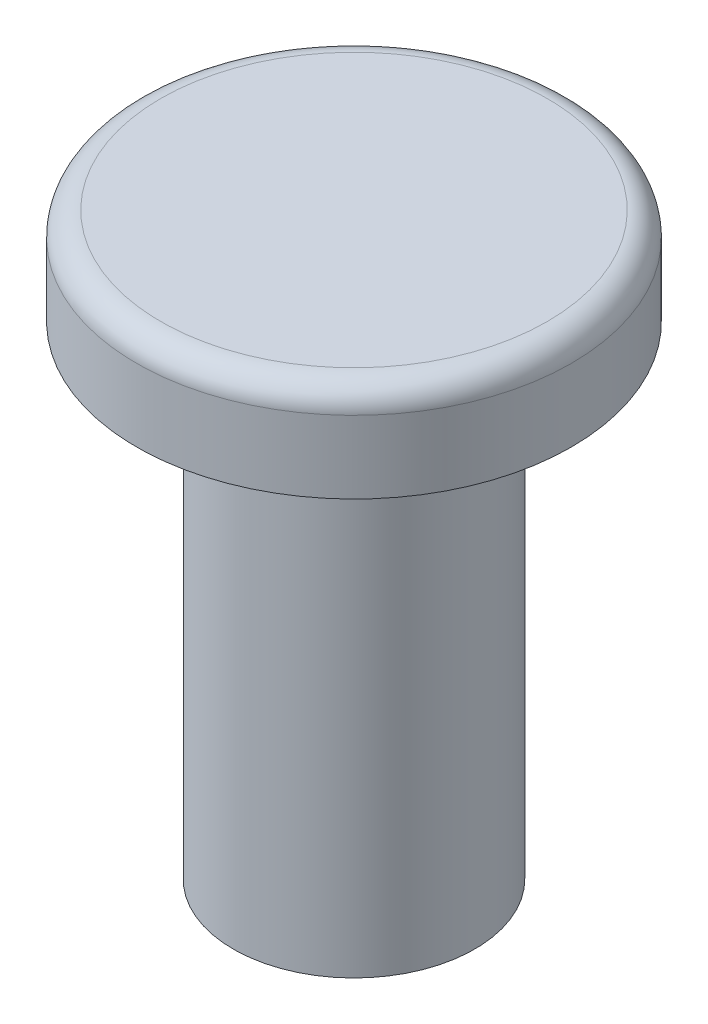
ISO-10303-21;
HEADER;
FILE_DESCRIPTION(('STEP AP214'),'2;1');
FILE_NAME('part.step','',(''),(''),'','','');
FILE_SCHEMA(('AUTOMOTIVE_DESIGN { 1 0 10303 214 1 1 1 1 }'));
ENDSEC;
DATA;
#1=APPLICATION_CONTEXT('core data for automotive mechanical design processes');
#2=APPLICATION_PROTOCOL_DEFINITION('international standard','automotive_design',2000,#1);
#3=PRODUCT_CONTEXT('',#1,'mechanical');
#4=PRODUCT('Part','Part','',(#3));
#5=PRODUCT_RELATED_PRODUCT_CATEGORY('part','',(#4));
#6=PRODUCT_DEFINITION_FORMATION('','',#4);
#7=PRODUCT_DEFINITION_CONTEXT('part definition',#1,'design');
#8=PRODUCT_DEFINITION('design','',#6,#7);
#9=PRODUCT_DEFINITION_SHAPE('','',#8);
#10=(LENGTH_UNIT() NAMED_UNIT(*) SI_UNIT(.MILLI.,.METRE.));
#11=(NAMED_UNIT(*) PLANE_ANGLE_UNIT() SI_UNIT($,.RADIAN.));
#12=(NAMED_UNIT(*) SI_UNIT($,.STERADIAN.) SOLID_ANGLE_UNIT());
#13=UNCERTAINTY_MEASURE_WITH_UNIT(LENGTH_MEASURE(1.E-05),#10,'distance_accuracy_value','');
#14=(GEOMETRIC_REPRESENTATION_CONTEXT(3) GLOBAL_UNCERTAINTY_ASSIGNED_CONTEXT((#13)) GLOBAL_UNIT_ASSIGNED_CONTEXT((#10,
#11,#12)) REPRESENTATION_CONTEXT('',''));
#15=CARTESIAN_POINT('',(0.,0.,0.));
#16=DIRECTION('',(0.,0.,1.));
#17=DIRECTION('',(1.,0.,0.));
#18=AXIS2_PLACEMENT_3D('',#15,#16,#17);
#19=CARTESIAN_POINT('',(0.,5.8019801980198,0.));
#20=DIRECTION('',(0.,1.,0.));
#21=DIRECTION('',(-1.,0.,0.));
#22=AXIS2_PLACEMENT_3D('',#19,#20,#21);
#23=PLANE('',#22);
#24=CARTESIAN_POINT('',(0.,5.8019801980198,0.));
#25=DIRECTION('',(0.,1.,0.));
#26=DIRECTION('',(-1.,0.,0.));
#27=AXIS2_PLACEMENT_3D('',#24,#25,#26);
#28=CIRCLE('',#27,2.);
#29=CARTESIAN_POINT('',(-2.,5.8019801980198,0.));
#30=VERTEX_POINT('',#29);
#31=EDGE_CURVE('E44',#30,#30,#28,.T.);
#32=ORIENTED_EDGE('',*,*,#31,.T.);
#33=EDGE_LOOP('',(#32));
#34=FACE_BOUND('',#33,.T.);
#35=ADVANCED_FACE('F37',(#34),#23,.T.);
#36=CARTESIAN_POINT('',(0.,5.8019801980198,0.));
#37=DIRECTION('',(0.,1.,0.));
#38=DIRECTION('',(-1.,0.,0.));
#39=AXIS2_PLACEMENT_3D('',#36,#37,#38);
#40=CYLINDRICAL_SURFACE('',#39,2.25);
#41=CARTESIAN_POINT('',(0.,5.5519801980198,0.));
#42=DIRECTION('',(0.,1.,0.));
#43=DIRECTION('',(-1.,0.,0.));
#44=AXIS2_PLACEMENT_3D('',#41,#42,#43);
#45=CIRCLE('',#44,2.25);
#46=CARTESIAN_POINT('',(-2.25,5.5519801980198,0.));
#47=VERTEX_POINT('',#46);
#48=EDGE_CURVE('E10',#47,#47,#45,.F.);
#49=ORIENTED_EDGE('',*,*,#48,.T.);
#50=EDGE_LOOP('',(#49));
#51=FACE_BOUND('',#50,.T.);
#52=CARTESIAN_POINT('',(0.,4.8019801980198,0.));
#53=DIRECTION('',(0.,1.,0.));
#54=DIRECTION('',(-1.,0.,0.));
#55=AXIS2_PLACEMENT_3D('',#52,#53,#54);
#56=CIRCLE('',#55,2.25);
#57=CARTESIAN_POINT('',(-2.25,4.8019801980198,0.));
#58=VERTEX_POINT('',#57);
#59=EDGE_CURVE('E48',#58,#58,#56,.T.);
#60=ORIENTED_EDGE('',*,*,#59,.T.);
#61=EDGE_LOOP('',(#60));
#62=FACE_BOUND('',#61,.T.);
#63=ADVANCED_FACE('F75',(#51,#62),#40,.T.);
#64=CARTESIAN_POINT('',(-2.25,4.8019801980198,0.));
#65=DIRECTION('',(0.,-1.,0.));
#66=DIRECTION('',(1.,0.,0.));
#67=AXIS2_PLACEMENT_3D('',#64,#65,#66);
#68=PLANE('',#67);
#69=CARTESIAN_POINT('',(0.,4.8019801980198,0.));
#70=DIRECTION('',(0.,1.,0.));
#71=DIRECTION('',(-1.,0.,0.));
#72=AXIS2_PLACEMENT_3D('',#69,#70,#71);
#73=CIRCLE('',#72,1.25);
#74=CARTESIAN_POINT('',(-1.25,4.8019801980198,0.));
#75=VERTEX_POINT('',#74);
#76=EDGE_CURVE('E52',#75,#75,#73,.T.);
#77=ORIENTED_EDGE('',*,*,#76,.T.);
#78=EDGE_LOOP('',(#77));
#79=FACE_BOUND('',#78,.T.);
#80=ORIENTED_EDGE('',*,*,#59,.F.);
#81=EDGE_LOOP('',(#80));
#82=FACE_BOUND('',#81,.T.);
#83=ADVANCED_FACE('F73',(#79,#82),#68,.T.);
#84=CARTESIAN_POINT('',(0.,5.8019801980198,0.));
#85=DIRECTION('',(0.,1.,0.));
#86=DIRECTION('',(-1.,0.,0.));
#87=AXIS2_PLACEMENT_3D('',#84,#85,#86);
#88=CYLINDRICAL_SURFACE('',#87,1.25);
#89=CARTESIAN_POINT('',(0.,-0.198019801980196,0.));
#90=DIRECTION('',(0.,1.,0.));
#91=DIRECTION('',(-1.,0.,0.));
#92=AXIS2_PLACEMENT_3D('',#89,#90,#91);
#93=CIRCLE('',#92,1.25);
#94=CARTESIAN_POINT('',(-1.25,-0.198019801980196,0.));
#95=VERTEX_POINT('',#94);
#96=EDGE_CURVE('E57',#95,#95,#93,.T.);
#97=ORIENTED_EDGE('',*,*,#96,.T.);
#98=EDGE_LOOP('',(#97));
#99=FACE_BOUND('',#98,.T.);
#100=ORIENTED_EDGE('',*,*,#76,.F.);
#101=EDGE_LOOP('',(#100));
#102=FACE_BOUND('',#101,.T.);
#103=ADVANCED_FACE('F61',(#99,#102),#88,.T.);
#104=CARTESIAN_POINT('',(-1.25,-0.198019801980196,0.));
#105=DIRECTION('',(0.,-1.,0.));
#106=DIRECTION('',(1.,0.,0.));
#107=AXIS2_PLACEMENT_3D('',#104,#105,#106);
#108=PLANE('',#107);
#109=ORIENTED_EDGE('',*,*,#96,.F.);
#110=EDGE_LOOP('',(#109));
#111=FACE_BOUND('',#110,.T.);
#112=ADVANCED_FACE('F64',(#111),#108,.T.);
#113=CARTESIAN_POINT('',(0.,5.5519801980198,0.));
#114=DIRECTION('',(0.,1.,0.));
#115=DIRECTION('',(-1.,0.,0.));
#116=AXIS2_PLACEMENT_3D('',#113,#114,#115);
#117=TOROIDAL_SURFACE('',#116,2.,0.25);
#118=ORIENTED_EDGE('',*,*,#48,.F.);
#119=EDGE_LOOP('',(#118));
#120=FACE_BOUND('',#119,.T.);
#121=ORIENTED_EDGE('',*,*,#31,.F.);
#122=EDGE_LOOP('',(#121));
#123=FACE_BOUND('',#122,.T.);
#124=ADVANCED_FACE('F39',(#120,#123),#117,.T.);
#125=CLOSED_SHELL('',(#35,#63,#83,#103,#112,#124));
#126=MANIFOLD_SOLID_BREP('B2',#125);
#127=ADVANCED_BREP_SHAPE_REPRESENTATION('',(#18,#126),#14);
#128=SHAPE_DEFINITION_REPRESENTATION(#9,#127);
ENDSEC;
END-ISO-10303-21;
